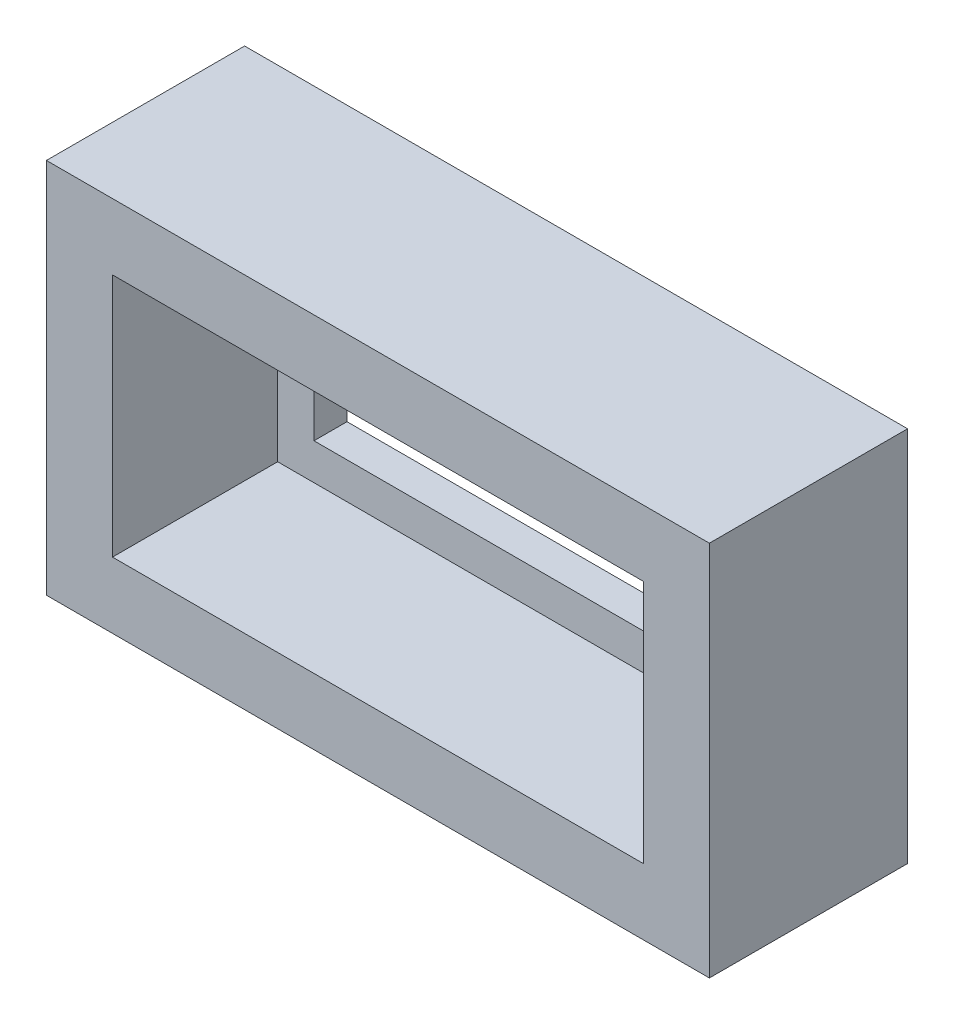
ISO-10303-21;
HEADER;
FILE_DESCRIPTION(('STEP AP214'),'2;1');
FILE_NAME('part.step','',(''),(''),'','','');
FILE_SCHEMA(('AUTOMOTIVE_DESIGN { 1 0 10303 214 1 1 1 1 }'));
ENDSEC;
DATA;
#1=APPLICATION_CONTEXT('core data for automotive mechanical design processes');
#2=APPLICATION_PROTOCOL_DEFINITION('international standard','automotive_design',2000,#1);
#3=PRODUCT_CONTEXT('',#1,'mechanical');
#4=PRODUCT('Part','Part','',(#3));
#5=PRODUCT_RELATED_PRODUCT_CATEGORY('part','',(#4));
#6=PRODUCT_DEFINITION_FORMATION('','',#4);
#7=PRODUCT_DEFINITION_CONTEXT('part definition',#1,'design');
#8=PRODUCT_DEFINITION('design','',#6,#7);
#9=PRODUCT_DEFINITION_SHAPE('','',#8);
#10=(LENGTH_UNIT() NAMED_UNIT(*) SI_UNIT(.MILLI.,.METRE.));
#11=(NAMED_UNIT(*) PLANE_ANGLE_UNIT() SI_UNIT($,.RADIAN.));
#12=(NAMED_UNIT(*) SI_UNIT($,.STERADIAN.) SOLID_ANGLE_UNIT());
#13=UNCERTAINTY_MEASURE_WITH_UNIT(LENGTH_MEASURE(1.E-05),#10,'distance_accuracy_value','');
#14=(GEOMETRIC_REPRESENTATION_CONTEXT(3) GLOBAL_UNCERTAINTY_ASSIGNED_CONTEXT((#13)) GLOBAL_UNIT_ASSIGNED_CONTEXT((#10,
#11,#12)) REPRESENTATION_CONTEXT('',''));
#15=CARTESIAN_POINT('',(0.,0.,0.));
#16=DIRECTION('',(0.,0.,1.));
#17=DIRECTION('',(1.,0.,0.));
#18=AXIS2_PLACEMENT_3D('',#15,#16,#17);
#19=CARTESIAN_POINT('',(0.,0.,6.));
#20=DIRECTION('',(0.,0.,-1.));
#21=DIRECTION('',(-1.,0.,0.));
#22=AXIS2_PLACEMENT_3D('',#19,#20,#21);
#23=PLANE('',#22);
#24=DIRECTION('',(0.,1.,0.));
#25=VECTOR('',#24,1.);
#26=CARTESIAN_POINT('',(10.035,-5.7,6.));
#27=LINE('',#26,#25);
#28=CARTESIAN_POINT('',(10.035,-5.7,6.));
#29=VERTEX_POINT('',#28);
#30=CARTESIAN_POINT('',(10.035,5.7,6.));
#31=VERTEX_POINT('',#30);
#32=EDGE_CURVE('E277',#29,#31,#27,.T.);
#33=ORIENTED_EDGE('',*,*,#32,.T.);
#34=DIRECTION('',(-1.,0.,0.));
#35=VECTOR('',#34,1.);
#36=CARTESIAN_POINT('',(-10.035,5.7,6.));
#37=LINE('',#36,#35);
#38=CARTESIAN_POINT('',(-10.035,5.7,6.));
#39=VERTEX_POINT('',#38);
#40=EDGE_CURVE('E280',#31,#39,#37,.T.);
#41=ORIENTED_EDGE('',*,*,#40,.T.);
#42=DIRECTION('',(0.,-1.,0.));
#43=VECTOR('',#42,1.);
#44=CARTESIAN_POINT('',(-10.035,-5.7,6.));
#45=LINE('',#44,#43);
#46=CARTESIAN_POINT('',(-10.035,-5.7,6.));
#47=VERTEX_POINT('',#46);
#48=EDGE_CURVE('E283',#39,#47,#45,.T.);
#49=ORIENTED_EDGE('',*,*,#48,.T.);
#50=DIRECTION('',(1.,0.,0.));
#51=VECTOR('',#50,1.);
#52=CARTESIAN_POINT('',(-10.035,-5.7,6.));
#53=LINE('',#52,#51);
#54=EDGE_CURVE('E285',#47,#29,#53,.T.);
#55=ORIENTED_EDGE('',*,*,#54,.T.);
#56=EDGE_LOOP('',(#33,#41,#49,#55));
#57=FACE_BOUND('',#56,.T.);
#58=DIRECTION('',(0.,1.,0.));
#59=VECTOR('',#58,1.);
#60=CARTESIAN_POINT('',(8.035,-3.7,6.));
#61=LINE('',#60,#59);
#62=CARTESIAN_POINT('',(8.035,-3.7,6.));
#63=VERTEX_POINT('',#62);
#64=CARTESIAN_POINT('',(8.035,3.7,6.));
#65=VERTEX_POINT('',#64);
#66=EDGE_CURVE('E259',#63,#65,#61,.T.);
#67=ORIENTED_EDGE('',*,*,#66,.F.);
#68=DIRECTION('',(1.,0.,0.));
#69=VECTOR('',#68,1.);
#70=CARTESIAN_POINT('',(-8.035,-3.7,6.));
#71=LINE('',#70,#69);
#72=CARTESIAN_POINT('',(-8.035,-3.7,6.));
#73=VERTEX_POINT('',#72);
#74=EDGE_CURVE('E266',#73,#63,#71,.T.);
#75=ORIENTED_EDGE('',*,*,#74,.F.);
#76=DIRECTION('',(0.,-1.,0.));
#77=VECTOR('',#76,1.);
#78=CARTESIAN_POINT('',(-8.035,-3.7,6.));
#79=LINE('',#78,#77);
#80=CARTESIAN_POINT('',(-8.035,3.7,6.));
#81=VERTEX_POINT('',#80);
#82=EDGE_CURVE('E263',#81,#73,#79,.T.);
#83=ORIENTED_EDGE('',*,*,#82,.F.);
#84=DIRECTION('',(-1.,0.,0.));
#85=VECTOR('',#84,1.);
#86=CARTESIAN_POINT('',(-8.035,3.7,6.));
#87=LINE('',#86,#85);
#88=EDGE_CURVE('E261',#65,#81,#87,.T.);
#89=ORIENTED_EDGE('',*,*,#88,.F.);
#90=EDGE_LOOP('',(#67,#75,#83,#89));
#91=FACE_BOUND('',#90,.T.);
#92=ADVANCED_FACE('F33',(#57,#91),#23,.F.);
#93=CARTESIAN_POINT('',(0.,0.,0.));
#94=DIRECTION('',(0.,0.,-1.));
#95=DIRECTION('',(-1.,0.,0.));
#96=AXIS2_PLACEMENT_3D('',#93,#94,#95);
#97=PLANE('',#96);
#98=DIRECTION('',(0.,-1.,0.));
#99=VECTOR('',#98,1.);
#100=CARTESIAN_POINT('',(-8.035,3.11,0.));
#101=LINE('',#100,#99);
#102=CARTESIAN_POINT('',(-8.035,3.7,0.));
#103=VERTEX_POINT('',#102);
#104=CARTESIAN_POINT('',(-8.035,3.11,0.));
#105=VERTEX_POINT('',#104);
#106=EDGE_CURVE('E164',#103,#105,#101,.T.);
#107=ORIENTED_EDGE('',*,*,#106,.T.);
#108=DIRECTION('',(1.,0.,0.));
#109=VECTOR('',#108,1.);
#110=CARTESIAN_POINT('',(-8.035,3.11,0.));
#111=LINE('',#110,#109);
#112=CARTESIAN_POINT('',(-6.915,3.11,0.));
#113=VERTEX_POINT('',#112);
#114=EDGE_CURVE('E176',#105,#113,#111,.T.);
#115=ORIENTED_EDGE('',*,*,#114,.T.);
#116=DIRECTION('',(0.,1.,0.));
#117=VECTOR('',#116,1.);
#118=CARTESIAN_POINT('',(-6.915,3.11,0.));
#119=LINE('',#118,#117);
#120=CARTESIAN_POINT('',(-6.915,3.7,0.));
#121=VERTEX_POINT('',#120);
#122=EDGE_CURVE('E48',#113,#121,#119,.T.);
#123=ORIENTED_EDGE('',*,*,#122,.T.);
#124=DIRECTION('',(-1.,0.,0.));
#125=VECTOR('',#124,1.);
#126=CARTESIAN_POINT('',(-8.035,3.7,0.));
#127=LINE('',#126,#125);
#128=EDGE_CURVE('E173',#121,#103,#127,.T.);
#129=ORIENTED_EDGE('',*,*,#128,.T.);
#130=EDGE_LOOP('',(#107,#115,#123,#129));
#131=FACE_BOUND('',#130,.T.);
#132=DIRECTION('',(0.,-1.,0.));
#133=VECTOR('',#132,1.);
#134=CARTESIAN_POINT('',(6.915,-3.7,0.));
#135=LINE('',#134,#133);
#136=CARTESIAN_POINT('',(6.915,-3.11,0.));
#137=VERTEX_POINT('',#136);
#138=CARTESIAN_POINT('',(6.915,-3.7,0.));
#139=VERTEX_POINT('',#138);
#140=EDGE_CURVE('E197',#137,#139,#135,.T.);
#141=ORIENTED_EDGE('',*,*,#140,.T.);
#142=DIRECTION('',(1.,0.,0.));
#143=VECTOR('',#142,1.);
#144=CARTESIAN_POINT('',(6.915,-3.7,0.));
#145=LINE('',#144,#143);
#146=CARTESIAN_POINT('',(8.035,-3.7,0.));
#147=VERTEX_POINT('',#146);
#148=EDGE_CURVE('E200',#139,#147,#145,.T.);
#149=ORIENTED_EDGE('',*,*,#148,.T.);
#150=DIRECTION('',(0.,1.,0.));
#151=VECTOR('',#150,1.);
#152=CARTESIAN_POINT('',(8.035,-3.7,0.));
#153=LINE('',#152,#151);
#154=CARTESIAN_POINT('',(8.035,-3.11,0.));
#155=VERTEX_POINT('',#154);
#156=EDGE_CURVE('E204',#147,#155,#153,.T.);
#157=ORIENTED_EDGE('',*,*,#156,.T.);
#158=DIRECTION('',(-1.,0.,0.));
#159=VECTOR('',#158,1.);
#160=CARTESIAN_POINT('',(6.915,-3.11,0.));
#161=LINE('',#160,#159);
#162=EDGE_CURVE('E207',#155,#137,#161,.T.);
#163=ORIENTED_EDGE('',*,*,#162,.T.);
#164=EDGE_LOOP('',(#141,#149,#157,#163));
#165=FACE_BOUND('',#164,.T.);
#166=DIRECTION('',(0.,1.,0.));
#167=VECTOR('',#166,1.);
#168=CARTESIAN_POINT('',(10.035,-5.7,0.));
#169=LINE('',#168,#167);
#170=CARTESIAN_POINT('',(10.035,-5.7,0.));
#171=VERTEX_POINT('',#170);
#172=CARTESIAN_POINT('',(10.035,5.7,0.));
#173=VERTEX_POINT('',#172);
#174=EDGE_CURVE('E276',#171,#173,#169,.T.);
#175=ORIENTED_EDGE('',*,*,#174,.F.);
#176=DIRECTION('',(1.,0.,0.));
#177=VECTOR('',#176,1.);
#178=CARTESIAN_POINT('',(-10.035,-5.7,0.));
#179=LINE('',#178,#177);
#180=CARTESIAN_POINT('',(-10.035,-5.7,0.));
#181=VERTEX_POINT('',#180);
#182=EDGE_CURVE('E281',#181,#171,#179,.T.);
#183=ORIENTED_EDGE('',*,*,#182,.F.);
#184=DIRECTION('',(0.,-1.,0.));
#185=VECTOR('',#184,1.);
#186=CARTESIAN_POINT('',(-10.035,-5.7,0.));
#187=LINE('',#186,#185);
#188=CARTESIAN_POINT('',(-10.035,5.7,0.));
#189=VERTEX_POINT('',#188);
#190=EDGE_CURVE('E292',#189,#181,#187,.T.);
#191=ORIENTED_EDGE('',*,*,#190,.F.);
#192=DIRECTION('',(-1.,0.,0.));
#193=VECTOR('',#192,1.);
#194=CARTESIAN_POINT('',(-10.035,5.7,0.));
#195=LINE('',#194,#193);
#196=EDGE_CURVE('E290',#173,#189,#195,.T.);
#197=ORIENTED_EDGE('',*,*,#196,.F.);
#198=EDGE_LOOP('',(#175,#183,#191,#197));
#199=FACE_BOUND('',#198,.T.);
#200=DIRECTION('',(1.,0.,0.));
#201=VECTOR('',#200,1.);
#202=CARTESIAN_POINT('',(6.935,2.6,0.));
#203=LINE('',#202,#201);
#204=CARTESIAN_POINT('',(-6.935,2.6,0.));
#205=VERTEX_POINT('',#204);
#206=CARTESIAN_POINT('',(6.935,2.6,0.));
#207=VERTEX_POINT('',#206);
#208=EDGE_CURVE('E235',#205,#207,#203,.T.);
#209=ORIENTED_EDGE('',*,*,#208,.F.);
#210=DIRECTION('',(0.,1.,0.));
#211=VECTOR('',#210,1.);
#212=CARTESIAN_POINT('',(-6.935,-2.6,0.));
#213=LINE('',#212,#211);
#214=CARTESIAN_POINT('',(-6.935,-2.6,0.));
#215=VERTEX_POINT('',#214);
#216=EDGE_CURVE('E195',#215,#205,#213,.T.);
#217=ORIENTED_EDGE('',*,*,#216,.F.);
#218=DIRECTION('',(-1.,0.,0.));
#219=VECTOR('',#218,1.);
#220=CARTESIAN_POINT('',(6.935,-2.6,0.));
#221=LINE('',#220,#219);
#222=CARTESIAN_POINT('',(6.935,-2.6,0.));
#223=VERTEX_POINT('',#222);
#224=EDGE_CURVE('E224',#223,#215,#221,.T.);
#225=ORIENTED_EDGE('',*,*,#224,.F.);
#226=DIRECTION('',(0.,-1.,0.));
#227=VECTOR('',#226,1.);
#228=CARTESIAN_POINT('',(6.935,-2.6,0.));
#229=LINE('',#228,#227);
#230=EDGE_CURVE('E238',#207,#223,#229,.T.);
#231=ORIENTED_EDGE('',*,*,#230,.F.);
#232=EDGE_LOOP('',(#209,#217,#225,#231));
#233=FACE_BOUND('',#232,.T.);
#234=ADVANCED_FACE('F180',(#131,#165,#199,#233),#97,.T.);
#235=CARTESIAN_POINT('',(10.035,-5.7,6.));
#236=DIRECTION('',(-1.,0.,0.));
#237=DIRECTION('',(0.,0.,1.));
#238=AXIS2_PLACEMENT_3D('',#235,#236,#237);
#239=PLANE('',#238);
#240=ORIENTED_EDGE('',*,*,#174,.T.);
#241=DIRECTION('',(0.,0.,-1.));
#242=VECTOR('',#241,1.);
#243=CARTESIAN_POINT('',(10.035,5.7,6.));
#244=LINE('',#243,#242);
#245=EDGE_CURVE('E11',#31,#173,#244,.T.);
#246=ORIENTED_EDGE('',*,*,#245,.F.);
#247=ORIENTED_EDGE('',*,*,#32,.F.);
#248=DIRECTION('',(0.,0.,-1.));
#249=VECTOR('',#248,1.);
#250=CARTESIAN_POINT('',(10.035,-5.7,6.));
#251=LINE('',#250,#249);
#252=EDGE_CURVE('E287',#29,#171,#251,.T.);
#253=ORIENTED_EDGE('',*,*,#252,.T.);
#254=EDGE_LOOP('',(#240,#246,#247,#253));
#255=FACE_BOUND('',#254,.T.);
#256=ADVANCED_FACE('F35',(#255),#239,.F.);
#257=CARTESIAN_POINT('',(-10.035,5.7,6.));
#258=DIRECTION('',(0.,-1.,0.));
#259=DIRECTION('',(0.,0.,-1.));
#260=AXIS2_PLACEMENT_3D('',#257,#258,#259);
#261=PLANE('',#260);
#262=ORIENTED_EDGE('',*,*,#196,.T.);
#263=DIRECTION('',(0.,0.,-1.));
#264=VECTOR('',#263,1.);
#265=CARTESIAN_POINT('',(-10.035,5.7,6.));
#266=LINE('',#265,#264);
#267=EDGE_CURVE('E41',#39,#189,#266,.T.);
#268=ORIENTED_EDGE('',*,*,#267,.F.);
#269=ORIENTED_EDGE('',*,*,#40,.F.);
#270=ORIENTED_EDGE('',*,*,#245,.T.);
#271=EDGE_LOOP('',(#262,#268,#269,#270));
#272=FACE_BOUND('',#271,.T.);
#273=ADVANCED_FACE('F320',(#272),#261,.F.);
#274=CARTESIAN_POINT('',(-10.035,-5.7,6.));
#275=DIRECTION('',(1.,0.,0.));
#276=DIRECTION('',(0.,0.,-1.));
#277=AXIS2_PLACEMENT_3D('',#274,#275,#276);
#278=PLANE('',#277);
#279=ORIENTED_EDGE('',*,*,#190,.T.);
#280=DIRECTION('',(0.,0.,-1.));
#281=VECTOR('',#280,1.);
#282=CARTESIAN_POINT('',(-10.035,-5.7,6.));
#283=LINE('',#282,#281);
#284=EDGE_CURVE('E297',#47,#181,#283,.T.);
#285=ORIENTED_EDGE('',*,*,#284,.F.);
#286=ORIENTED_EDGE('',*,*,#48,.F.);
#287=ORIENTED_EDGE('',*,*,#267,.T.);
#288=EDGE_LOOP('',(#279,#285,#286,#287));
#289=FACE_BOUND('',#288,.T.);
#290=ADVANCED_FACE('F304',(#289),#278,.F.);
#291=CARTESIAN_POINT('',(-10.035,-5.7,6.));
#292=DIRECTION('',(0.,1.,0.));
#293=DIRECTION('',(0.,0.,1.));
#294=AXIS2_PLACEMENT_3D('',#291,#292,#293);
#295=PLANE('',#294);
#296=ORIENTED_EDGE('',*,*,#182,.T.);
#297=ORIENTED_EDGE('',*,*,#252,.F.);
#298=ORIENTED_EDGE('',*,*,#54,.F.);
#299=ORIENTED_EDGE('',*,*,#284,.T.);
#300=EDGE_LOOP('',(#296,#297,#298,#299));
#301=FACE_BOUND('',#300,.T.);
#302=ADVANCED_FACE('F313',(#301),#295,.F.);
#303=CARTESIAN_POINT('',(8.035,-3.7,6.));
#304=DIRECTION('',(-1.,0.,0.));
#305=DIRECTION('',(0.,0.,1.));
#306=AXIS2_PLACEMENT_3D('',#303,#304,#305);
#307=PLANE('',#306);
#308=DIRECTION('',(0.,-1.,0.));
#309=VECTOR('',#308,1.);
#310=CARTESIAN_POINT('',(8.035,-3.7,1.));
#311=LINE('',#310,#309);
#312=CARTESIAN_POINT('',(8.035,3.7,1.));
#313=VERTEX_POINT('',#312);
#314=CARTESIAN_POINT('',(8.035,-3.11,1.));
#315=VERTEX_POINT('',#314);
#316=EDGE_CURVE('E254',#313,#315,#311,.T.);
#317=ORIENTED_EDGE('',*,*,#316,.T.);
#318=DIRECTION('',(0.,0.,1.));
#319=VECTOR('',#318,1.);
#320=CARTESIAN_POINT('',(8.035,-3.11,0.));
#321=LINE('',#320,#319);
#322=EDGE_CURVE('E216',#155,#315,#321,.T.);
#323=ORIENTED_EDGE('',*,*,#322,.F.);
#324=ORIENTED_EDGE('',*,*,#156,.F.);
#325=DIRECTION('',(0.,0.,-1.));
#326=VECTOR('',#325,1.);
#327=CARTESIAN_POINT('',(8.035,-3.7,6.));
#328=LINE('',#327,#326);
#329=EDGE_CURVE('E56',#63,#147,#328,.T.);
#330=ORIENTED_EDGE('',*,*,#329,.F.);
#331=ORIENTED_EDGE('',*,*,#66,.T.);
#332=DIRECTION('',(0.,0.,-1.));
#333=VECTOR('',#332,1.);
#334=CARTESIAN_POINT('',(8.035,3.7,6.));
#335=LINE('',#334,#333);
#336=EDGE_CURVE('E273',#65,#313,#335,.T.);
#337=ORIENTED_EDGE('',*,*,#336,.T.);
#338=EDGE_LOOP('',(#317,#323,#324,#330,#331,#337));
#339=FACE_BOUND('',#338,.T.);
#340=ADVANCED_FACE('F334',(#339),#307,.T.);
#341=CARTESIAN_POINT('',(-8.035,3.7,6.));
#342=DIRECTION('',(0.,-1.,0.));
#343=DIRECTION('',(0.,0.,-1.));
#344=AXIS2_PLACEMENT_3D('',#341,#342,#343);
#345=PLANE('',#344);
#346=DIRECTION('',(0.,0.,-1.));
#347=VECTOR('',#346,1.);
#348=CARTESIAN_POINT('',(-8.035,3.7,6.));
#349=LINE('',#348,#347);
#350=EDGE_CURVE('E271',#81,#103,#349,.T.);
#351=ORIENTED_EDGE('',*,*,#350,.T.);
#352=ORIENTED_EDGE('',*,*,#128,.F.);
#353=DIRECTION('',(0.,0.,1.));
#354=VECTOR('',#353,1.);
#355=CARTESIAN_POINT('',(-6.915,3.7,0.));
#356=LINE('',#355,#354);
#357=CARTESIAN_POINT('',(-6.915,3.7,1.));
#358=VERTEX_POINT('',#357);
#359=EDGE_CURVE('E193',#121,#358,#356,.T.);
#360=ORIENTED_EDGE('',*,*,#359,.T.);
#361=DIRECTION('',(1.,0.,0.));
#362=VECTOR('',#361,1.);
#363=CARTESIAN_POINT('',(8.035,3.7,1.));
#364=LINE('',#363,#362);
#365=EDGE_CURVE('E252',#358,#313,#364,.T.);
#366=ORIENTED_EDGE('',*,*,#365,.T.);
#367=ORIENTED_EDGE('',*,*,#336,.F.);
#368=ORIENTED_EDGE('',*,*,#88,.T.);
#369=EDGE_LOOP('',(#351,#352,#360,#366,#367,#368));
#370=FACE_BOUND('',#369,.T.);
#371=ADVANCED_FACE('F341',(#370),#345,.T.);
#372=CARTESIAN_POINT('',(-8.035,-3.7,6.));
#373=DIRECTION('',(1.,0.,0.));
#374=DIRECTION('',(0.,0.,-1.));
#375=AXIS2_PLACEMENT_3D('',#372,#373,#374);
#376=PLANE('',#375);
#377=DIRECTION('',(0.,1.,0.));
#378=VECTOR('',#377,1.);
#379=CARTESIAN_POINT('',(-8.035,-3.7,1.));
#380=LINE('',#379,#378);
#381=CARTESIAN_POINT('',(-8.035,-3.7,1.));
#382=VERTEX_POINT('',#381);
#383=CARTESIAN_POINT('',(-8.035,3.11,1.));
#384=VERTEX_POINT('',#383);
#385=EDGE_CURVE('E168',#382,#384,#380,.T.);
#386=ORIENTED_EDGE('',*,*,#385,.T.);
#387=DIRECTION('',(0.,0.,1.));
#388=VECTOR('',#387,1.);
#389=CARTESIAN_POINT('',(-8.035,3.11,0.));
#390=LINE('',#389,#388);
#391=EDGE_CURVE('E159',#105,#384,#390,.T.);
#392=ORIENTED_EDGE('',*,*,#391,.F.);
#393=ORIENTED_EDGE('',*,*,#106,.F.);
#394=ORIENTED_EDGE('',*,*,#350,.F.);
#395=ORIENTED_EDGE('',*,*,#82,.T.);
#396=DIRECTION('',(0.,0.,-1.));
#397=VECTOR('',#396,1.);
#398=CARTESIAN_POINT('',(-8.035,-3.7,6.));
#399=LINE('',#398,#397);
#400=EDGE_CURVE('E269',#73,#382,#399,.T.);
#401=ORIENTED_EDGE('',*,*,#400,.T.);
#402=EDGE_LOOP('',(#386,#392,#393,#394,#395,#401));
#403=FACE_BOUND('',#402,.T.);
#404=ADVANCED_FACE('F161',(#403),#376,.T.);
#405=CARTESIAN_POINT('',(-8.035,-3.7,6.));
#406=DIRECTION('',(0.,1.,0.));
#407=DIRECTION('',(0.,0.,1.));
#408=AXIS2_PLACEMENT_3D('',#405,#406,#407);
#409=PLANE('',#408);
#410=ORIENTED_EDGE('',*,*,#329,.T.);
#411=ORIENTED_EDGE('',*,*,#148,.F.);
#412=DIRECTION('',(0.,0.,1.));
#413=VECTOR('',#412,1.);
#414=CARTESIAN_POINT('',(6.915,-3.7,0.));
#415=LINE('',#414,#413);
#416=CARTESIAN_POINT('',(6.915,-3.7,1.));
#417=VERTEX_POINT('',#416);
#418=EDGE_CURVE('E210',#139,#417,#415,.T.);
#419=ORIENTED_EDGE('',*,*,#418,.T.);
#420=DIRECTION('',(-1.,0.,0.));
#421=VECTOR('',#420,1.);
#422=CARTESIAN_POINT('',(8.035,-3.7,1.));
#423=LINE('',#422,#421);
#424=EDGE_CURVE('E257',#417,#382,#423,.T.);
#425=ORIENTED_EDGE('',*,*,#424,.T.);
#426=ORIENTED_EDGE('',*,*,#400,.F.);
#427=ORIENTED_EDGE('',*,*,#74,.T.);
#428=EDGE_LOOP('',(#410,#411,#419,#425,#426,#427));
#429=FACE_BOUND('',#428,.T.);
#430=ADVANCED_FACE('F397',(#429),#409,.T.);
#431=CARTESIAN_POINT('',(0.,0.,1.));
#432=DIRECTION('',(0.,0.,1.));
#433=DIRECTION('',(1.,0.,0.));
#434=AXIS2_PLACEMENT_3D('',#431,#432,#433);
#435=PLANE('',#434);
#436=DIRECTION('',(0.,1.,0.));
#437=VECTOR('',#436,1.);
#438=CARTESIAN_POINT('',(-6.915,3.11,1.));
#439=LINE('',#438,#437);
#440=CARTESIAN_POINT('',(-6.915,3.11,1.));
#441=VERTEX_POINT('',#440);
#442=EDGE_CURVE('E183',#441,#358,#439,.T.);
#443=ORIENTED_EDGE('',*,*,#442,.F.);
#444=DIRECTION('',(1.,0.,0.));
#445=VECTOR('',#444,1.);
#446=CARTESIAN_POINT('',(-8.035,3.11,1.));
#447=LINE('',#446,#445);
#448=EDGE_CURVE('E186',#384,#441,#447,.T.);
#449=ORIENTED_EDGE('',*,*,#448,.F.);
#450=ORIENTED_EDGE('',*,*,#385,.F.);
#451=ORIENTED_EDGE('',*,*,#424,.F.);
#452=DIRECTION('',(0.,-1.,0.));
#453=VECTOR('',#452,1.);
#454=CARTESIAN_POINT('',(6.915,-3.7,1.));
#455=LINE('',#454,#453);
#456=CARTESIAN_POINT('',(6.915,-3.11,1.));
#457=VERTEX_POINT('',#456);
#458=EDGE_CURVE('E211',#457,#417,#455,.T.);
#459=ORIENTED_EDGE('',*,*,#458,.F.);
#460=DIRECTION('',(-1.,0.,0.));
#461=VECTOR('',#460,1.);
#462=CARTESIAN_POINT('',(6.915,-3.11,1.));
#463=LINE('',#462,#461);
#464=EDGE_CURVE('E201',#315,#457,#463,.T.);
#465=ORIENTED_EDGE('',*,*,#464,.F.);
#466=ORIENTED_EDGE('',*,*,#316,.F.);
#467=ORIENTED_EDGE('',*,*,#365,.F.);
#468=EDGE_LOOP('',(#443,#449,#450,#451,#459,#465,#466,#467));
#469=FACE_BOUND('',#468,.T.);
#470=DIRECTION('',(0.,1.,0.));
#471=VECTOR('',#470,1.);
#472=CARTESIAN_POINT('',(-6.935,-2.6,1.));
#473=LINE('',#472,#471);
#474=CARTESIAN_POINT('',(-6.935,-2.6,1.));
#475=VERTEX_POINT('',#474);
#476=CARTESIAN_POINT('',(-6.935,2.6,1.));
#477=VERTEX_POINT('',#476);
#478=EDGE_CURVE('E220',#475,#477,#473,.T.);
#479=ORIENTED_EDGE('',*,*,#478,.T.);
#480=DIRECTION('',(1.,0.,0.));
#481=VECTOR('',#480,1.);
#482=CARTESIAN_POINT('',(6.935,2.6,1.));
#483=LINE('',#482,#481);
#484=CARTESIAN_POINT('',(6.935,2.6,1.));
#485=VERTEX_POINT('',#484);
#486=EDGE_CURVE('E223',#477,#485,#483,.T.);
#487=ORIENTED_EDGE('',*,*,#486,.T.);
#488=DIRECTION('',(0.,-1.,0.));
#489=VECTOR('',#488,1.);
#490=CARTESIAN_POINT('',(6.935,-2.6,1.));
#491=LINE('',#490,#489);
#492=CARTESIAN_POINT('',(6.935,-2.6,1.));
#493=VERTEX_POINT('',#492);
#494=EDGE_CURVE('E227',#485,#493,#491,.T.);
#495=ORIENTED_EDGE('',*,*,#494,.T.);
#496=DIRECTION('',(-1.,0.,0.));
#497=VECTOR('',#496,1.);
#498=CARTESIAN_POINT('',(6.935,-2.6,1.));
#499=LINE('',#498,#497);
#500=EDGE_CURVE('E230',#493,#475,#499,.T.);
#501=ORIENTED_EDGE('',*,*,#500,.T.);
#502=EDGE_LOOP('',(#479,#487,#495,#501));
#503=FACE_BOUND('',#502,.T.);
#504=ADVANCED_FACE('F354',(#469,#503),#435,.T.);
#505=CARTESIAN_POINT('',(-6.935,-2.6,1.));
#506=DIRECTION('',(-1.,0.,0.));
#507=DIRECTION('',(0.,0.,1.));
#508=AXIS2_PLACEMENT_3D('',#505,#506,#507);
#509=PLANE('',#508);
#510=ORIENTED_EDGE('',*,*,#216,.T.);
#511=DIRECTION('',(0.,0.,-1.));
#512=VECTOR('',#511,1.);
#513=CARTESIAN_POINT('',(-6.935,2.6,1.));
#514=LINE('',#513,#512);
#515=EDGE_CURVE('E233',#477,#205,#514,.T.);
#516=ORIENTED_EDGE('',*,*,#515,.F.);
#517=ORIENTED_EDGE('',*,*,#478,.F.);
#518=DIRECTION('',(0.,0.,-1.));
#519=VECTOR('',#518,1.);
#520=CARTESIAN_POINT('',(-6.935,-2.6,1.));
#521=LINE('',#520,#519);
#522=EDGE_CURVE('E243',#475,#215,#521,.T.);
#523=ORIENTED_EDGE('',*,*,#522,.T.);
#524=EDGE_LOOP('',(#510,#516,#517,#523));
#525=FACE_BOUND('',#524,.T.);
#526=ADVANCED_FACE('F384',(#525),#509,.F.);
#527=CARTESIAN_POINT('',(6.935,-2.6,1.));
#528=DIRECTION('',(0.,-1.,0.));
#529=DIRECTION('',(0.,0.,-1.));
#530=AXIS2_PLACEMENT_3D('',#527,#528,#529);
#531=PLANE('',#530);
#532=ORIENTED_EDGE('',*,*,#224,.T.);
#533=ORIENTED_EDGE('',*,*,#522,.F.);
#534=ORIENTED_EDGE('',*,*,#500,.F.);
#535=DIRECTION('',(0.,0.,-1.));
#536=VECTOR('',#535,1.);
#537=CARTESIAN_POINT('',(6.935,-2.6,1.));
#538=LINE('',#537,#536);
#539=EDGE_CURVE('E245',#493,#223,#538,.T.);
#540=ORIENTED_EDGE('',*,*,#539,.T.);
#541=EDGE_LOOP('',(#532,#533,#534,#540));
#542=FACE_BOUND('',#541,.T.);
#543=ADVANCED_FACE('F380',(#542),#531,.F.);
#544=CARTESIAN_POINT('',(6.935,-2.6,1.));
#545=DIRECTION('',(1.,0.,0.));
#546=DIRECTION('',(0.,0.,-1.));
#547=AXIS2_PLACEMENT_3D('',#544,#545,#546);
#548=PLANE('',#547);
#549=ORIENTED_EDGE('',*,*,#230,.T.);
#550=ORIENTED_EDGE('',*,*,#539,.F.);
#551=ORIENTED_EDGE('',*,*,#494,.F.);
#552=DIRECTION('',(0.,0.,-1.));
#553=VECTOR('',#552,1.);
#554=CARTESIAN_POINT('',(6.935,2.6,1.));
#555=LINE('',#554,#553);
#556=EDGE_CURVE('E247',#485,#207,#555,.T.);
#557=ORIENTED_EDGE('',*,*,#556,.T.);
#558=EDGE_LOOP('',(#549,#550,#551,#557));
#559=FACE_BOUND('',#558,.T.);
#560=ADVANCED_FACE('F383',(#559),#548,.F.);
#561=CARTESIAN_POINT('',(6.935,2.6,1.));
#562=DIRECTION('',(0.,1.,0.));
#563=DIRECTION('',(0.,0.,1.));
#564=AXIS2_PLACEMENT_3D('',#561,#562,#563);
#565=PLANE('',#564);
#566=ORIENTED_EDGE('',*,*,#208,.T.);
#567=ORIENTED_EDGE('',*,*,#556,.F.);
#568=ORIENTED_EDGE('',*,*,#486,.F.);
#569=ORIENTED_EDGE('',*,*,#515,.T.);
#570=EDGE_LOOP('',(#566,#567,#568,#569));
#571=FACE_BOUND('',#570,.T.);
#572=ADVANCED_FACE('F378',(#571),#565,.F.);
#573=CARTESIAN_POINT('',(6.915,-3.7,0.));
#574=DIRECTION('',(-1.,0.,0.));
#575=DIRECTION('',(0.,-1.,0.));
#576=AXIS2_PLACEMENT_3D('',#573,#574,#575);
#577=PLANE('',#576);
#578=ORIENTED_EDGE('',*,*,#458,.T.);
#579=ORIENTED_EDGE('',*,*,#418,.F.);
#580=ORIENTED_EDGE('',*,*,#140,.F.);
#581=DIRECTION('',(0.,0.,1.));
#582=VECTOR('',#581,1.);
#583=CARTESIAN_POINT('',(6.915,-3.11,0.));
#584=LINE('',#583,#582);
#585=EDGE_CURVE('E191',#137,#457,#584,.T.);
#586=ORIENTED_EDGE('',*,*,#585,.T.);
#587=EDGE_LOOP('',(#578,#579,#580,#586));
#588=FACE_BOUND('',#587,.T.);
#589=ADVANCED_FACE('F373',(#588),#577,.F.);
#590=CARTESIAN_POINT('',(6.915,-3.11,0.));
#591=DIRECTION('',(0.,1.,0.));
#592=DIRECTION('',(0.,0.,1.));
#593=AXIS2_PLACEMENT_3D('',#590,#591,#592);
#594=PLANE('',#593);
#595=ORIENTED_EDGE('',*,*,#464,.T.);
#596=ORIENTED_EDGE('',*,*,#585,.F.);
#597=ORIENTED_EDGE('',*,*,#162,.F.);
#598=ORIENTED_EDGE('',*,*,#322,.T.);
#599=EDGE_LOOP('',(#595,#596,#597,#598));
#600=FACE_BOUND('',#599,.T.);
#601=ADVANCED_FACE('F359',(#600),#594,.F.);
#602=CARTESIAN_POINT('',(-6.915,3.11,0.));
#603=DIRECTION('',(1.,0.,0.));
#604=DIRECTION('',(0.,0.,-1.));
#605=AXIS2_PLACEMENT_3D('',#602,#603,#604);
#606=PLANE('',#605);
#607=ORIENTED_EDGE('',*,*,#442,.T.);
#608=ORIENTED_EDGE('',*,*,#359,.F.);
#609=ORIENTED_EDGE('',*,*,#122,.F.);
#610=DIRECTION('',(0.,0.,1.));
#611=VECTOR('',#610,1.);
#612=CARTESIAN_POINT('',(-6.915,3.11,0.));
#613=LINE('',#612,#611);
#614=EDGE_CURVE('E172',#113,#441,#613,.T.);
#615=ORIENTED_EDGE('',*,*,#614,.T.);
#616=EDGE_LOOP('',(#607,#608,#609,#615));
#617=FACE_BOUND('',#616,.T.);
#618=ADVANCED_FACE('F365',(#617),#606,.F.);
#619=CARTESIAN_POINT('',(-8.035,3.11,0.));
#620=DIRECTION('',(0.,-1.,0.));
#621=DIRECTION('',(0.,0.,-1.));
#622=AXIS2_PLACEMENT_3D('',#619,#620,#621);
#623=PLANE('',#622);
#624=ORIENTED_EDGE('',*,*,#448,.T.);
#625=ORIENTED_EDGE('',*,*,#614,.F.);
#626=ORIENTED_EDGE('',*,*,#114,.F.);
#627=ORIENTED_EDGE('',*,*,#391,.T.);
#628=EDGE_LOOP('',(#624,#625,#626,#627));
#629=FACE_BOUND('',#628,.T.);
#630=ADVANCED_FACE('F177',(#629),#623,.F.);
#631=CLOSED_SHELL('',(#92,#234,#256,#273,#290,#302,#340,#371,#404,#430,#504,#526,#543,#560,#572,
#589,#601,#618,#630));
#632=MANIFOLD_SOLID_BREP('B2',#631);
#633=ADVANCED_BREP_SHAPE_REPRESENTATION('',(#18,#632),#14);
#634=SHAPE_DEFINITION_REPRESENTATION(#9,#633);
ENDSEC;
END-ISO-10303-21;
